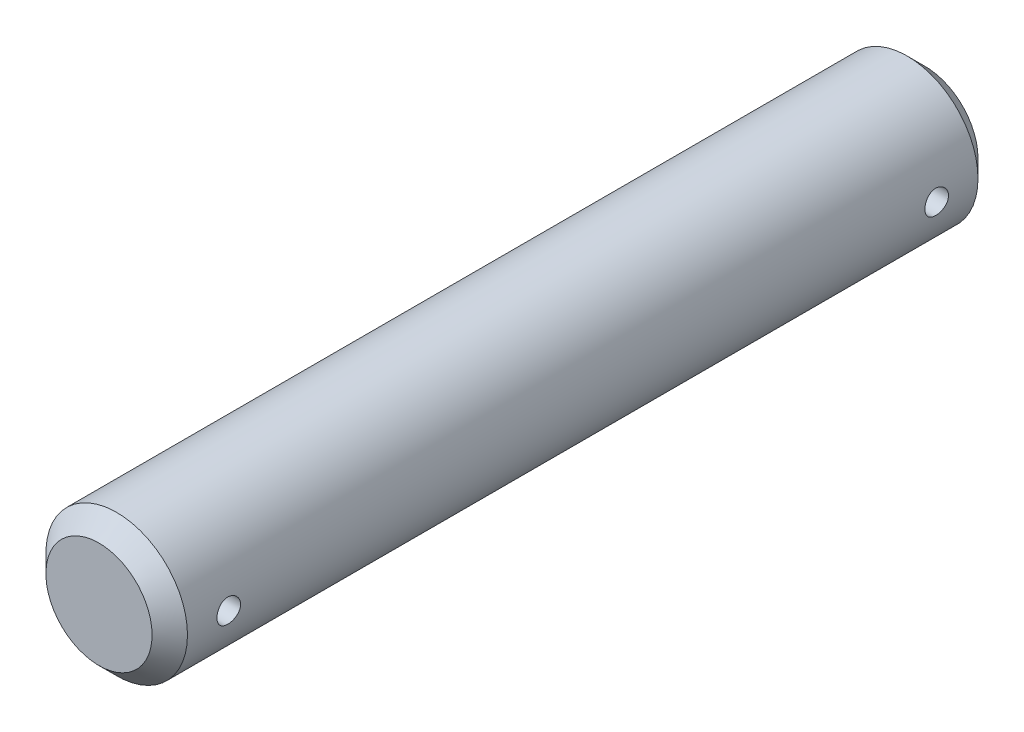
ISO-10303-21;
HEADER;
FILE_DESCRIPTION(('STEP AP214'),'2;1');
FILE_NAME('part.step','',(''),(''),'','','');
FILE_SCHEMA(('AUTOMOTIVE_DESIGN { 1 0 10303 214 1 1 1 1 }'));
ENDSEC;
DATA;
#1=APPLICATION_CONTEXT('core data for automotive mechanical design processes');
#2=APPLICATION_PROTOCOL_DEFINITION('international standard','automotive_design',2000,#1);
#3=PRODUCT_CONTEXT('',#1,'mechanical');
#4=PRODUCT('Part','Part','',(#3));
#5=PRODUCT_RELATED_PRODUCT_CATEGORY('part','',(#4));
#6=PRODUCT_DEFINITION_FORMATION('','',#4);
#7=PRODUCT_DEFINITION_CONTEXT('part definition',#1,'design');
#8=PRODUCT_DEFINITION('design','',#6,#7);
#9=PRODUCT_DEFINITION_SHAPE('','',#8);
#10=(LENGTH_UNIT() NAMED_UNIT(*) SI_UNIT(.MILLI.,.METRE.));
#11=(NAMED_UNIT(*) PLANE_ANGLE_UNIT() SI_UNIT($,.RADIAN.));
#12=(NAMED_UNIT(*) SI_UNIT($,.STERADIAN.) SOLID_ANGLE_UNIT());
#13=UNCERTAINTY_MEASURE_WITH_UNIT(LENGTH_MEASURE(1.E-05),#10,'distance_accuracy_value','');
#14=(GEOMETRIC_REPRESENTATION_CONTEXT(3) GLOBAL_UNCERTAINTY_ASSIGNED_CONTEXT((#13)) GLOBAL_UNIT_ASSIGNED_CONTEXT((#10,
#11,#12)) REPRESENTATION_CONTEXT('',''));
#15=CARTESIAN_POINT('',(0.,0.,0.));
#16=DIRECTION('',(0.,0.,1.));
#17=DIRECTION('',(1.,0.,0.));
#18=AXIS2_PLACEMENT_3D('',#15,#16,#17);
#19=CARTESIAN_POINT('',(0.,0.,-35.));
#20=DIRECTION('',(0.,0.,1.));
#21=DIRECTION('',(1.,0.,0.));
#22=AXIS2_PLACEMENT_3D('',#19,#20,#21);
#23=PLANE('',#22);
#24=CARTESIAN_POINT('',(0.,0.,-35.));
#25=DIRECTION('',(0.,0.,1.));
#26=DIRECTION('',(1.,0.,0.));
#27=AXIS2_PLACEMENT_3D('',#24,#25,#26);
#28=CIRCLE('',#27,4.5);
#29=CARTESIAN_POINT('',(4.5,0.,-35.));
#30=VERTEX_POINT('',#29);
#31=EDGE_CURVE('E83',#30,#30,#28,.T.);
#32=ORIENTED_EDGE('',*,*,#31,.F.);
#33=EDGE_LOOP('',(#32));
#34=FACE_BOUND('',#33,.T.);
#35=ADVANCED_FACE('F34',(#34),#23,.F.);
#36=CARTESIAN_POINT('',(0.,0.,-35.));
#37=DIRECTION('',(0.,0.,1.));
#38=DIRECTION('',(1.,0.,0.));
#39=AXIS2_PLACEMENT_3D('',#36,#37,#38);
#40=CONICAL_SURFACE('',#39,4.5,0.785398163397448);
#41=CARTESIAN_POINT('',(0.,0.,-33.5));
#42=DIRECTION('',(0.,0.,1.));
#43=DIRECTION('',(1.,0.,0.));
#44=AXIS2_PLACEMENT_3D('',#41,#42,#43);
#45=CIRCLE('',#44,6.);
#46=CARTESIAN_POINT('',(6.,0.,-33.5));
#47=VERTEX_POINT('',#46);
#48=EDGE_CURVE('E86',#47,#47,#45,.T.);
#49=ORIENTED_EDGE('',*,*,#48,.F.);
#50=EDGE_LOOP('',(#49));
#51=FACE_BOUND('',#50,.T.);
#52=ORIENTED_EDGE('',*,*,#31,.T.);
#53=EDGE_LOOP('',(#52));
#54=FACE_BOUND('',#53,.T.);
#55=ADVANCED_FACE('F104',(#51,#54),#40,.T.);
#56=CARTESIAN_POINT('',(0.,0.,35.));
#57=DIRECTION('',(0.,0.,1.));
#58=DIRECTION('',(1.,0.,0.));
#59=AXIS2_PLACEMENT_3D('',#56,#57,#58);
#60=CYLINDRICAL_SURFACE('',#59,6.);
#61=CARTESIAN_POINT('',(-6.,0.,-31.));
#62=CARTESIAN_POINT('',(-5.99999904467529,0.055756361983286,-30.9999977644209));
#63=CARTESIAN_POINT('',(-5.99921471165214,0.111543152735529,-30.9953210900124));
#64=CARTESIAN_POINT('',(-5.99616137976555,0.221552088669217,-30.9767457364939));
#65=CARTESIAN_POINT('',(-5.99389101569556,0.275772747183699,-30.9628385772354));
#66=CARTESIAN_POINT('',(-5.9881202729458,0.381041898885058,-30.9262338205629));
#67=CARTESIAN_POINT('',(-5.98462090063677,0.432092947372761,-30.9035434137438));
#68=CARTESIAN_POINT('',(-5.97677690832828,0.529656736791178,-30.850035083179));
#69=CARTESIAN_POINT('',(-5.97243238501774,0.576169995951437,-30.8192180890068));
#70=CARTESIAN_POINT('',(-5.96333326983325,0.663789045716673,-30.7500179664718));
#71=CARTESIAN_POINT('',(-5.95857548725943,0.704845161413988,-30.7115723541456));
#72=CARTESIAN_POINT('',(-5.94921050750693,0.779955399463972,-30.6283408126109));
#73=CARTESIAN_POINT('',(-5.94460331985067,0.814009079756389,-30.5835544834174));
#74=CARTESIAN_POINT('',(-5.93603026303912,0.874346850242053,-30.4885716135212));
#75=CARTESIAN_POINT('',(-5.93206851636654,0.900581821144401,-30.4383434652781));
#76=CARTESIAN_POINT('',(-5.9252791591787,0.944223346164488,-30.3341161742798));
#77=CARTESIAN_POINT('',(-5.92245147205723,0.961630496626246,-30.280117286529));
#78=CARTESIAN_POINT('',(-5.91828214737102,0.986965751113925,-30.1704078900574));
#79=CARTESIAN_POINT('',(-5.9169270739428,0.994979611654162,-30.1147177053994));
#80=CARTESIAN_POINT('',(-5.9158157557466,1.00156669011595,-30.0027678892466));
#81=CARTESIAN_POINT('',(-5.91605939782886,1.0001405761556,-29.9465082983331));
#82=CARTESIAN_POINT('',(-5.91810571545422,0.987958039358462,-29.8356288554898));
#83=CARTESIAN_POINT('',(-5.91989229327567,0.97729795275591,-29.7809980785819));
#84=CARTESIAN_POINT('',(-5.92479798084403,0.947101256161379,-29.6743114728684));
#85=CARTESIAN_POINT('',(-5.92791713629309,0.927564341727898,-29.6222557324446));
#86=CARTESIAN_POINT('',(-5.9351539173364,0.880070898437567,-29.5219084706236));
#87=CARTESIAN_POINT('',(-5.9392762684293,0.852074365551888,-29.4736362375675));
#88=CARTESIAN_POINT('',(-5.94805167366003,0.788484807022975,-29.3824382397846));
#89=CARTESIAN_POINT('',(-5.95270477061714,0.752891168261716,-29.339512907018));
#90=CARTESIAN_POINT('',(-5.96208811151914,0.674592884863623,-29.2596695656771));
#91=CARTESIAN_POINT('',(-5.96681859692661,0.631805585549252,-29.222832592584));
#92=CARTESIAN_POINT('',(-5.97577040558689,0.54061409959266,-29.1568488949339));
#93=CARTESIAN_POINT('',(-5.97999172555898,0.49220987676257,-29.1277022199267));
#94=CARTESIAN_POINT('',(-5.98745557157165,0.391082366466685,-29.0779191091455));
#95=CARTESIAN_POINT('',(-5.99069727362979,0.338355490225865,-29.0572898322675));
#96=CARTESIAN_POINT('',(-5.99583001205064,0.230119338241094,-29.0252023139016));
#97=CARTESIAN_POINT('',(-5.9977211614019,0.174610295671789,-29.0137433052105));
#98=CARTESIAN_POINT('',(-5.99992451937074,0.063083960520651,-29.0004314566156));
#99=CARTESIAN_POINT('',(-6.00025501205114,0.00708029486040592,-28.9984673712778));
#100=CARTESIAN_POINT('',(-5.99934989768468,-0.104455909155954,-29.0039045377712));
#101=CARTESIAN_POINT('',(-5.99811435089647,-0.159988465556815,-29.0113054292535));
#102=CARTESIAN_POINT('',(-5.99422730775281,-0.268662470218705,-29.0351699397342));
#103=CARTESIAN_POINT('',(-5.99158441920524,-0.321816347354151,-29.051578483356));
#104=CARTESIAN_POINT('',(-5.98517785782143,-0.424618753944177,-29.0929338072798));
#105=CARTESIAN_POINT('',(-5.98141412204808,-0.474267086363888,-29.1178810670541));
#106=CARTESIAN_POINT('',(-5.97313806520963,-0.569132275787585,-29.1758604498787));
#107=CARTESIAN_POINT('',(-5.96861942354809,-0.61430610037486,-29.2089620624669));
#108=CARTESIAN_POINT('',(-5.9593538695676,-0.698497434201076,-29.282214926154));
#109=CARTESIAN_POINT('',(-5.95460694068619,-0.737514495878634,-29.3223666893107));
#110=CARTESIAN_POINT('',(-5.94536070094338,-0.808697111863202,-29.4090790192286));
#111=CARTESIAN_POINT('',(-5.94086446454842,-0.840787504445488,-29.4557016662058));
#112=CARTESIAN_POINT('',(-5.93268611911154,-0.896680924117996,-29.5537411876554));
#113=CARTESIAN_POINT('',(-5.92900398426408,-0.92048421390793,-29.605157910091));
#114=CARTESIAN_POINT('',(-5.92289381479082,-0.95901533258926,-29.7111158931249));
#115=CARTESIAN_POINT('',(-5.92046061724426,-0.973780573019179,-29.7656432380122));
#116=CARTESIAN_POINT('',(-5.91711086734104,-0.993934181511312,-29.8764480516887));
#117=CARTESIAN_POINT('',(-5.91619418313089,-0.999323364778469,-29.9327253678928));
#118=CARTESIAN_POINT('',(-5.91598693233605,-1.00054914641894,-30.044682066385));
#119=CARTESIAN_POINT('',(-5.9166762260226,-0.996504054450076,-30.1003601514301));
#120=CARTESIAN_POINT('',(-5.91955912581491,-0.979231935582741,-30.2102316992203));
#121=CARTESIAN_POINT('',(-5.92175272704486,-0.966004938444992,-30.2644251667767));
#122=CARTESIAN_POINT('',(-5.92738942512687,-0.930789795837963,-30.369743374917));
#123=CARTESIAN_POINT('',(-5.93083106887868,-0.908811836240179,-30.4208716040224));
#124=CARTESIAN_POINT('',(-5.93857747568883,-0.856730801566366,-30.5187342676779));
#125=CARTESIAN_POINT('',(-5.9428822815536,-0.826627323499428,-30.5654684841489));
#126=CARTESIAN_POINT('',(-5.95193381618249,-0.758727553748865,-30.6538142332431));
#127=CARTESIAN_POINT('',(-5.95668518230521,-0.720844225437461,-30.6953584066801));
#128=CARTESIAN_POINT('',(-5.96605748944336,-0.638643612552094,-30.77154064179));
#129=CARTESIAN_POINT('',(-5.97067840010619,-0.594324845165057,-30.8061771074553));
#130=CARTESIAN_POINT('',(-5.97930611856888,-0.500147667856114,-30.86777930728));
#131=CARTESIAN_POINT('',(-5.98330846501242,-0.450253115013128,-30.8946904157252));
#132=CARTESIAN_POINT('',(-5.9902046704071,-0.346605227751593,-30.939707793844));
#133=CARTESIAN_POINT('',(-5.99309963270993,-0.292855797932005,-30.9578228324319));
#134=CARTESIAN_POINT('',(-5.99682316333182,-0.199081324018162,-30.9808021096507));
#135=CARTESIAN_POINT('',(-5.99800810909344,-0.15962353211938,-30.9879897878464));
#136=CARTESIAN_POINT('',(-5.99959686394448,-0.0801157241279242,-30.9975894951379));
#137=CARTESIAN_POINT('',(-6.00000068648257,-0.040065718243398,-31.0000016064549));
#138=CARTESIAN_POINT('',(-6.,0.,-31.));
#139=B_SPLINE_CURVE_WITH_KNOTS('',3,(#61,#62,#63,#64,#65,#66,#67,#68,#69,#70,#71,#72,#73,#74,
#75,#76,#77,#78,#79,#80,#81,#82,#83,#84,#85,#86,#87,#88,#89,#90,#91,#92,#93,#94,#95,#96,#97,#98,
#99,#100,#101,#102,#103,#104,#105,#106,#107,#108,#109,#110,#111,#112,#113,#114,#115,#116,#117,
#118,#119,#120,#121,#122,#123,#124,#125,#126,#127,#128,#129,#130,#131,#132,#133,#134,#135,#136,
#137,#138),.UNSPECIFIED.,.T.,.F.,(4,2,2,2,2,2,2,2,2,2,2,2,2,2,2,2,2,2,2,2,2,2,2,2,2,2,2,2,2,2,2,
2,2,2,2,2,2,2,4),(0.,0.167122633975404,0.334399018278169,0.50153874681011,0.668659365069918,
0.837209964249329,1.00577120067943,1.17537008329536,1.34495750750472,1.5129843084137,
1.68099921728355,1.84728208704164,2.01357066010153,2.18065822653023,2.3477592827223,
2.51693107964531,2.68610396654339,2.85541875566362,3.0247193780846,3.19203153396559,
3.35933725214344,3.52563122802567,3.69193454330427,3.8597073025081,4.02749225221714,
4.19701528803049,4.36653294950378,4.53534408936709,4.70414055114647,4.8708316380908,
5.03752218475254,5.2040192729049,5.37052462011735,5.53900553677357,5.7075253355159,
5.87720892642881,6.04672300852029,6.16681699265608,6.28690890910788),.UNSPECIFIED.);
#140=CARTESIAN_POINT('',(-6.,0.,-31.));
#141=VERTEX_POINT('',#140);
#142=EDGE_CURVE('E10',#141,#141,#139,.T.);
#143=ORIENTED_EDGE('',*,*,#142,.T.);
#144=EDGE_LOOP('',(#143));
#145=FACE_BOUND('',#144,.T.);
#146=CARTESIAN_POINT('',(6.,0.,-31.));
#147=CARTESIAN_POINT('',(5.99999904467529,-0.055756361983286,-30.9999977644209));
#148=CARTESIAN_POINT('',(5.99921471165214,-0.111543152735529,-30.9953210900124));
#149=CARTESIAN_POINT('',(5.99616137976555,-0.221552088669217,-30.9767457364939));
#150=CARTESIAN_POINT('',(5.99389101569556,-0.275772747183699,-30.9628385772354));
#151=CARTESIAN_POINT('',(5.9881202729458,-0.381041898885058,-30.9262338205629));
#152=CARTESIAN_POINT('',(5.98462090063677,-0.432092947372761,-30.9035434137438));
#153=CARTESIAN_POINT('',(5.97677690832828,-0.529656736791178,-30.850035083179));
#154=CARTESIAN_POINT('',(5.97243238501774,-0.576169995951437,-30.8192180890068));
#155=CARTESIAN_POINT('',(5.96333326983325,-0.663789045716673,-30.7500179664718));
#156=CARTESIAN_POINT('',(5.95857548725943,-0.704845161413988,-30.7115723541456));
#157=CARTESIAN_POINT('',(5.94921050750693,-0.779955399463972,-30.6283408126109));
#158=CARTESIAN_POINT('',(5.94460331985067,-0.814009079756389,-30.5835544834174));
#159=CARTESIAN_POINT('',(5.93603026303912,-0.874346850242053,-30.4885716135212));
#160=CARTESIAN_POINT('',(5.93206851636654,-0.900581821144401,-30.4383434652781));
#161=CARTESIAN_POINT('',(5.9252791591787,-0.944223346164488,-30.3341161742798));
#162=CARTESIAN_POINT('',(5.92245147205723,-0.961630496626246,-30.280117286529));
#163=CARTESIAN_POINT('',(5.91828214737102,-0.986965751113925,-30.1704078900574));
#164=CARTESIAN_POINT('',(5.9169270739428,-0.994979611654162,-30.1147177053994));
#165=CARTESIAN_POINT('',(5.9158157557466,-1.00156669011595,-30.0027678892466));
#166=CARTESIAN_POINT('',(5.91605939782886,-1.0001405761556,-29.9465082983331));
#167=CARTESIAN_POINT('',(5.91810571545422,-0.987958039358462,-29.8356288554898));
#168=CARTESIAN_POINT('',(5.91989229327567,-0.97729795275591,-29.7809980785819));
#169=CARTESIAN_POINT('',(5.92479798084403,-0.947101256161379,-29.6743114728684));
#170=CARTESIAN_POINT('',(5.92791713629309,-0.927564341727898,-29.6222557324446));
#171=CARTESIAN_POINT('',(5.9351539173364,-0.880070898437567,-29.5219084706236));
#172=CARTESIAN_POINT('',(5.9392762684293,-0.852074365551888,-29.4736362375675));
#173=CARTESIAN_POINT('',(5.94805167366003,-0.788484807022975,-29.3824382397846));
#174=CARTESIAN_POINT('',(5.95270477061714,-0.752891168261716,-29.339512907018));
#175=CARTESIAN_POINT('',(5.96208811151914,-0.674592884863623,-29.2596695656771));
#176=CARTESIAN_POINT('',(5.96681859692661,-0.631805585549252,-29.222832592584));
#177=CARTESIAN_POINT('',(5.97577040558689,-0.54061409959266,-29.1568488949339));
#178=CARTESIAN_POINT('',(5.97999172555898,-0.49220987676257,-29.1277022199267));
#179=CARTESIAN_POINT('',(5.98745557157165,-0.391082366466685,-29.0779191091455));
#180=CARTESIAN_POINT('',(5.99069727362979,-0.338355490225865,-29.0572898322675));
#181=CARTESIAN_POINT('',(5.99583001205064,-0.230119338241094,-29.0252023139016));
#182=CARTESIAN_POINT('',(5.9977211614019,-0.174610295671789,-29.0137433052105));
#183=CARTESIAN_POINT('',(5.99992451937074,-0.063083960520651,-29.0004314566156));
#184=CARTESIAN_POINT('',(6.00025501205114,-0.00708029486040592,-28.9984673712778));
#185=CARTESIAN_POINT('',(5.99934989768468,0.104455909155954,-29.0039045377712));
#186=CARTESIAN_POINT('',(5.99811435089647,0.159988465556815,-29.0113054292535));
#187=CARTESIAN_POINT('',(5.99422730775281,0.268662470218705,-29.0351699397342));
#188=CARTESIAN_POINT('',(5.99158441920524,0.321816347354151,-29.051578483356));
#189=CARTESIAN_POINT('',(5.98517785782143,0.424618753944177,-29.0929338072798));
#190=CARTESIAN_POINT('',(5.98141412204808,0.474267086363888,-29.1178810670541));
#191=CARTESIAN_POINT('',(5.97313806520963,0.569132275787585,-29.1758604498787));
#192=CARTESIAN_POINT('',(5.96861942354809,0.61430610037486,-29.2089620624669));
#193=CARTESIAN_POINT('',(5.9593538695676,0.698497434201076,-29.282214926154));
#194=CARTESIAN_POINT('',(5.95460694068619,0.737514495878634,-29.3223666893107));
#195=CARTESIAN_POINT('',(5.94536070094338,0.808697111863202,-29.4090790192286));
#196=CARTESIAN_POINT('',(5.94086446454842,0.840787504445488,-29.4557016662058));
#197=CARTESIAN_POINT('',(5.93268611911154,0.896680924117996,-29.5537411876554));
#198=CARTESIAN_POINT('',(5.92900398426408,0.92048421390793,-29.605157910091));
#199=CARTESIAN_POINT('',(5.92289381479082,0.95901533258926,-29.7111158931249));
#200=CARTESIAN_POINT('',(5.92046061724426,0.973780573019179,-29.7656432380122));
#201=CARTESIAN_POINT('',(5.91711086734104,0.993934181511312,-29.8764480516887));
#202=CARTESIAN_POINT('',(5.91619418313089,0.999323364778469,-29.9327253678928));
#203=CARTESIAN_POINT('',(5.91598693233605,1.00054914641894,-30.044682066385));
#204=CARTESIAN_POINT('',(5.9166762260226,0.996504054450076,-30.1003601514301));
#205=CARTESIAN_POINT('',(5.91955912581491,0.979231935582741,-30.2102316992203));
#206=CARTESIAN_POINT('',(5.92175272704486,0.966004938444992,-30.2644251667767));
#207=CARTESIAN_POINT('',(5.92738942512687,0.930789795837963,-30.369743374917));
#208=CARTESIAN_POINT('',(5.93083106887868,0.908811836240179,-30.4208716040224));
#209=CARTESIAN_POINT('',(5.93857747568883,0.856730801566366,-30.5187342676779));
#210=CARTESIAN_POINT('',(5.9428822815536,0.826627323499428,-30.5654684841489));
#211=CARTESIAN_POINT('',(5.95193381618249,0.758727553748865,-30.6538142332431));
#212=CARTESIAN_POINT('',(5.95668518230521,0.720844225437461,-30.6953584066801));
#213=CARTESIAN_POINT('',(5.96605748944336,0.638643612552094,-30.77154064179));
#214=CARTESIAN_POINT('',(5.97067840010619,0.594324845165057,-30.8061771074553));
#215=CARTESIAN_POINT('',(5.97930611856888,0.500147667856114,-30.86777930728));
#216=CARTESIAN_POINT('',(5.98330846501242,0.450253115013128,-30.8946904157252));
#217=CARTESIAN_POINT('',(5.9902046704071,0.346605227751593,-30.939707793844));
#218=CARTESIAN_POINT('',(5.99309963270993,0.292855797932005,-30.9578228324319));
#219=CARTESIAN_POINT('',(5.99682316333182,0.199081324018162,-30.9808021096507));
#220=CARTESIAN_POINT('',(5.99800810909344,0.15962353211938,-30.9879897878464));
#221=CARTESIAN_POINT('',(5.99959686394448,0.0801157241279242,-30.9975894951379));
#222=CARTESIAN_POINT('',(6.00000068648257,0.040065718243398,-31.0000016064549));
#223=CARTESIAN_POINT('',(6.,0.,-31.));
#224=B_SPLINE_CURVE_WITH_KNOTS('',3,(#146,#147,#148,#149,#150,#151,#152,#153,#154,#155,#156,
#157,#158,#159,#160,#161,#162,#163,#164,#165,#166,#167,#168,#169,#170,#171,#172,#173,#174,#175,
#176,#177,#178,#179,#180,#181,#182,#183,#184,#185,#186,#187,#188,#189,#190,#191,#192,#193,#194,
#195,#196,#197,#198,#199,#200,#201,#202,#203,#204,#205,#206,#207,#208,#209,#210,#211,#212,#213,
#214,#215,#216,#217,#218,#219,#220,#221,#222,#223),.UNSPECIFIED.,.T.,.F.,(4,2,2,2,2,2,2,2,2,2,2,
2,2,2,2,2,2,2,2,2,2,2,2,2,2,2,2,2,2,2,2,2,2,2,2,2,2,2,4),(0.,0.167122633975404,
0.334399018278169,0.50153874681011,0.668659365069918,0.837209964249329,1.00577120067943,
1.17537008329536,1.34495750750472,1.5129843084137,1.68099921728355,1.84728208704164,
2.01357066010153,2.18065822653023,2.3477592827223,2.51693107964531,2.68610396654339,
2.85541875566362,3.0247193780846,3.19203153396559,3.35933725214344,3.52563122802567,
3.69193454330427,3.8597073025081,4.02749225221714,4.19701528803049,4.36653294950378,
4.53534408936709,4.70414055114647,4.8708316380908,5.03752218475254,5.2040192729049,
5.37052462011735,5.53900553677357,5.7075253355159,5.87720892642881,6.04672300852029,
6.16681699265608,6.28690890910788),.UNSPECIFIED.);
#225=CARTESIAN_POINT('',(6.,0.,-31.));
#226=VERTEX_POINT('',#225);
#227=EDGE_CURVE('E45',#226,#226,#224,.T.);
#228=ORIENTED_EDGE('',*,*,#227,.T.);
#229=EDGE_LOOP('',(#228));
#230=FACE_BOUND('',#229,.T.);
#231=CARTESIAN_POINT('',(-6.,0.,29.));
#232=CARTESIAN_POINT('',(-5.99999904467529,0.055756361983286,29.0000022355791));
#233=CARTESIAN_POINT('',(-5.99921471165214,0.111543152735529,29.0046789099876));
#234=CARTESIAN_POINT('',(-5.99616137976555,0.221552088669217,29.0232542635061));
#235=CARTESIAN_POINT('',(-5.99389101569556,0.275772747183699,29.0371614227646));
#236=CARTESIAN_POINT('',(-5.9881202729458,0.381041898885058,29.0737661794371));
#237=CARTESIAN_POINT('',(-5.98462090063677,0.432092947372761,29.0964565862562));
#238=CARTESIAN_POINT('',(-5.97677690832828,0.529656736791178,29.149964916821));
#239=CARTESIAN_POINT('',(-5.97243238501774,0.576169995951437,29.1807819109932));
#240=CARTESIAN_POINT('',(-5.96333326983325,0.663789045716673,29.2499820335282));
#241=CARTESIAN_POINT('',(-5.95857548725943,0.704845161413988,29.2884276458545));
#242=CARTESIAN_POINT('',(-5.94921050750693,0.779955399463972,29.3716591873891));
#243=CARTESIAN_POINT('',(-5.94460331985067,0.814009079756389,29.4164455165826));
#244=CARTESIAN_POINT('',(-5.93603026303912,0.874346850242054,29.5114283864788));
#245=CARTESIAN_POINT('',(-5.93206851636654,0.900581821144402,29.5616565347219));
#246=CARTESIAN_POINT('',(-5.9252791591787,0.944223346164489,29.6658838257203));
#247=CARTESIAN_POINT('',(-5.92245147205723,0.961630496626247,29.7198827134711));
#248=CARTESIAN_POINT('',(-5.91828214737102,0.986965751113925,29.8295921099426));
#249=CARTESIAN_POINT('',(-5.9169270739428,0.994979611654162,29.8852822946006));
#250=CARTESIAN_POINT('',(-5.9158157557466,1.00156669011595,29.9972321107534));
#251=CARTESIAN_POINT('',(-5.91605939782886,1.0001405761556,30.0534917016669));
#252=CARTESIAN_POINT('',(-5.91810571545422,0.987958039358462,30.1643711445102));
#253=CARTESIAN_POINT('',(-5.91989229327567,0.97729795275591,30.2190019214181));
#254=CARTESIAN_POINT('',(-5.92479798084403,0.947101256161379,30.3256885271317));
#255=CARTESIAN_POINT('',(-5.92791713629309,0.927564341727898,30.3777442675554));
#256=CARTESIAN_POINT('',(-5.9351539173364,0.880070898437567,30.4780915293764));
#257=CARTESIAN_POINT('',(-5.9392762684293,0.852074365551888,30.5263637624325));
#258=CARTESIAN_POINT('',(-5.94805167366003,0.788484807022975,30.6175617602154));
#259=CARTESIAN_POINT('',(-5.95270477061714,0.752891168261716,30.660487092982));
#260=CARTESIAN_POINT('',(-5.96208811151914,0.674592884863623,30.7403304343229));
#261=CARTESIAN_POINT('',(-5.96681859692661,0.631805585549252,30.777167407416));
#262=CARTESIAN_POINT('',(-5.97577040558689,0.54061409959266,30.8431511050661));
#263=CARTESIAN_POINT('',(-5.97999172555898,0.49220987676257,30.8722977800733));
#264=CARTESIAN_POINT('',(-5.98745557157165,0.391082366466685,30.9220808908545));
#265=CARTESIAN_POINT('',(-5.99069727362979,0.338355490225865,30.9427101677325));
#266=CARTESIAN_POINT('',(-5.99583001205064,0.230119338241094,30.9747976860984));
#267=CARTESIAN_POINT('',(-5.9977211614019,0.174610295671789,30.9862566947895));
#268=CARTESIAN_POINT('',(-5.99992451937074,0.063083960520651,30.9995685433845));
#269=CARTESIAN_POINT('',(-6.00025501205114,0.00708029486040592,31.0015326287222));
#270=CARTESIAN_POINT('',(-5.99934989768468,-0.104455909155954,30.9960954622288));
#271=CARTESIAN_POINT('',(-5.99811435089647,-0.159988465556815,30.9886945707465));
#272=CARTESIAN_POINT('',(-5.99422730775281,-0.268662470218705,30.9648300602658));
#273=CARTESIAN_POINT('',(-5.99158441920524,-0.321816347354151,30.948421516644));
#274=CARTESIAN_POINT('',(-5.98517785782143,-0.424618753944177,30.9070661927202));
#275=CARTESIAN_POINT('',(-5.98141412204808,-0.474267086363888,30.8821189329459));
#276=CARTESIAN_POINT('',(-5.97313806520963,-0.569132275787585,30.8241395501213));
#277=CARTESIAN_POINT('',(-5.96861942354809,-0.61430610037486,30.7910379375331));
#278=CARTESIAN_POINT('',(-5.9593538695676,-0.698497434201076,30.717785073846));
#279=CARTESIAN_POINT('',(-5.95460694068619,-0.737514495878634,30.6776333106893));
#280=CARTESIAN_POINT('',(-5.94536070094338,-0.808697111863201,30.5909209807714));
#281=CARTESIAN_POINT('',(-5.94086446454842,-0.840787504445486,30.5442983337942));
#282=CARTESIAN_POINT('',(-5.93268611911154,-0.896680924117995,30.4462588123446));
#283=CARTESIAN_POINT('',(-5.92900398426408,-0.920484213907929,30.394842089909));
#284=CARTESIAN_POINT('',(-5.92289381479082,-0.95901533258926,30.2888841068752));
#285=CARTESIAN_POINT('',(-5.92046061724426,-0.973780573019179,30.2343567619878));
#286=CARTESIAN_POINT('',(-5.91711086734104,-0.993934181511312,30.1235519483113));
#287=CARTESIAN_POINT('',(-5.91619418313089,-0.999323364778469,30.0672746321072));
#288=CARTESIAN_POINT('',(-5.91598693233605,-1.00054914641894,29.955317933615));
#289=CARTESIAN_POINT('',(-5.9166762260226,-0.996504054450076,29.8996398485699));
#290=CARTESIAN_POINT('',(-5.91955912581491,-0.979231935582741,29.7897683007797));
#291=CARTESIAN_POINT('',(-5.92175272704486,-0.966004938444992,29.7355748332233));
#292=CARTESIAN_POINT('',(-5.92738942512688,-0.930789795837962,29.630256625083));
#293=CARTESIAN_POINT('',(-5.93083106887868,-0.908811836240178,29.5791283959776));
#294=CARTESIAN_POINT('',(-5.93857747568883,-0.856730801566365,29.4812657323221));
#295=CARTESIAN_POINT('',(-5.9428822815536,-0.826627323499427,29.4345315158511));
#296=CARTESIAN_POINT('',(-5.95193381618249,-0.758727553748865,29.3461857667569));
#297=CARTESIAN_POINT('',(-5.95668518230521,-0.720844225437462,29.3046415933199));
#298=CARTESIAN_POINT('',(-5.96605748944336,-0.638643612552095,29.22845935821));
#299=CARTESIAN_POINT('',(-5.97067840010619,-0.594324845165057,29.1938228925447));
#300=CARTESIAN_POINT('',(-5.97930611856888,-0.500147667856115,29.13222069272));
#301=CARTESIAN_POINT('',(-5.98330846501242,-0.450253115013129,29.1053095842748));
#302=CARTESIAN_POINT('',(-5.9902046704071,-0.346605227751595,29.060292206156));
#303=CARTESIAN_POINT('',(-5.99309963270993,-0.292855797932006,29.0421771675681));
#304=CARTESIAN_POINT('',(-5.99682316333182,-0.199081324018162,29.0191978903493));
#305=CARTESIAN_POINT('',(-5.99800810909344,-0.15962353211938,29.0120102121536));
#306=CARTESIAN_POINT('',(-5.99959686394448,-0.0801157241279242,29.0024105048621));
#307=CARTESIAN_POINT('',(-6.00000068648257,-0.040065718243398,28.9999983935451));
#308=CARTESIAN_POINT('',(-6.,0.,29.));
#309=B_SPLINE_CURVE_WITH_KNOTS('',3,(#231,#232,#233,#234,#235,#236,#237,#238,#239,#240,#241,
#242,#243,#244,#245,#246,#247,#248,#249,#250,#251,#252,#253,#254,#255,#256,#257,#258,#259,#260,
#261,#262,#263,#264,#265,#266,#267,#268,#269,#270,#271,#272,#273,#274,#275,#276,#277,#278,#279,
#280,#281,#282,#283,#284,#285,#286,#287,#288,#289,#290,#291,#292,#293,#294,#295,#296,#297,#298,
#299,#300,#301,#302,#303,#304,#305,#306,#307,#308),.UNSPECIFIED.,.T.,.F.,(4,2,2,2,2,2,2,2,2,2,2,
2,2,2,2,2,2,2,2,2,2,2,2,2,2,2,2,2,2,2,2,2,2,2,2,2,2,2,4),(0.,0.167122633975404,
0.334399018278169,0.50153874681011,0.668659365069918,0.837209964249329,1.00577120067943,
1.17537008329536,1.34495750750472,1.5129843084137,1.68099921728355,1.84728208704164,
2.01357066010153,2.18065822653023,2.3477592827223,2.51693107964531,2.68610396654339,
2.85541875566362,3.0247193780846,3.19203153396559,3.35933725214344,3.52563122802567,
3.69193454330427,3.8597073025081,4.02749225221714,4.19701528803048,4.36653294950378,
4.53534408936709,4.70414055114647,4.8708316380908,5.03752218475254,5.2040192729049,
5.37052462011735,5.53900553677357,5.7075253355159,5.87720892642881,6.04672300852029,
6.16681699265608,6.28690890910788),.UNSPECIFIED.);
#310=CARTESIAN_POINT('',(-6.,0.,29.));
#311=VERTEX_POINT('',#310);
#312=EDGE_CURVE('E49',#311,#311,#309,.T.);
#313=ORIENTED_EDGE('',*,*,#312,.T.);
#314=EDGE_LOOP('',(#313));
#315=FACE_BOUND('',#314,.T.);
#316=CARTESIAN_POINT('',(6.,0.,29.));
#317=CARTESIAN_POINT('',(5.99999904467529,-0.055756361983286,29.0000022355791));
#318=CARTESIAN_POINT('',(5.99921471165214,-0.111543152735529,29.0046789099876));
#319=CARTESIAN_POINT('',(5.99616137976555,-0.221552088669217,29.0232542635061));
#320=CARTESIAN_POINT('',(5.99389101569556,-0.275772747183699,29.0371614227646));
#321=CARTESIAN_POINT('',(5.9881202729458,-0.381041898885058,29.0737661794371));
#322=CARTESIAN_POINT('',(5.98462090063677,-0.432092947372761,29.0964565862562));
#323=CARTESIAN_POINT('',(5.97677690832828,-0.529656736791178,29.149964916821));
#324=CARTESIAN_POINT('',(5.97243238501774,-0.576169995951437,29.1807819109932));
#325=CARTESIAN_POINT('',(5.96333326983325,-0.663789045716673,29.2499820335282));
#326=CARTESIAN_POINT('',(5.95857548725943,-0.704845161413988,29.2884276458545));
#327=CARTESIAN_POINT('',(5.94921050750693,-0.779955399463972,29.3716591873891));
#328=CARTESIAN_POINT('',(5.94460331985067,-0.814009079756389,29.4164455165826));
#329=CARTESIAN_POINT('',(5.93603026303912,-0.874346850242054,29.5114283864788));
#330=CARTESIAN_POINT('',(5.93206851636654,-0.900581821144402,29.5616565347219));
#331=CARTESIAN_POINT('',(5.9252791591787,-0.944223346164489,29.6658838257203));
#332=CARTESIAN_POINT('',(5.92245147205723,-0.961630496626247,29.7198827134711));
#333=CARTESIAN_POINT('',(5.91828214737102,-0.986965751113925,29.8295921099426));
#334=CARTESIAN_POINT('',(5.9169270739428,-0.994979611654162,29.8852822946006));
#335=CARTESIAN_POINT('',(5.9158157557466,-1.00156669011595,29.9972321107534));
#336=CARTESIAN_POINT('',(5.91605939782886,-1.0001405761556,30.0534917016669));
#337=CARTESIAN_POINT('',(5.91810571545422,-0.987958039358462,30.1643711445102));
#338=CARTESIAN_POINT('',(5.91989229327567,-0.97729795275591,30.2190019214181));
#339=CARTESIAN_POINT('',(5.92479798084403,-0.947101256161379,30.3256885271317));
#340=CARTESIAN_POINT('',(5.92791713629309,-0.927564341727898,30.3777442675554));
#341=CARTESIAN_POINT('',(5.9351539173364,-0.880070898437567,30.4780915293764));
#342=CARTESIAN_POINT('',(5.9392762684293,-0.852074365551888,30.5263637624325));
#343=CARTESIAN_POINT('',(5.94805167366003,-0.788484807022975,30.6175617602154));
#344=CARTESIAN_POINT('',(5.95270477061714,-0.752891168261716,30.660487092982));
#345=CARTESIAN_POINT('',(5.96208811151914,-0.674592884863623,30.7403304343229));
#346=CARTESIAN_POINT('',(5.96681859692661,-0.631805585549252,30.777167407416));
#347=CARTESIAN_POINT('',(5.97577040558689,-0.54061409959266,30.8431511050661));
#348=CARTESIAN_POINT('',(5.97999172555898,-0.49220987676257,30.8722977800733));
#349=CARTESIAN_POINT('',(5.98745557157165,-0.391082366466685,30.9220808908545));
#350=CARTESIAN_POINT('',(5.99069727362979,-0.338355490225865,30.9427101677325));
#351=CARTESIAN_POINT('',(5.99583001205064,-0.230119338241094,30.9747976860984));
#352=CARTESIAN_POINT('',(5.9977211614019,-0.174610295671789,30.9862566947895));
#353=CARTESIAN_POINT('',(5.99992451937074,-0.063083960520651,30.9995685433845));
#354=CARTESIAN_POINT('',(6.00025501205114,-0.00708029486040592,31.0015326287222));
#355=CARTESIAN_POINT('',(5.99934989768468,0.104455909155954,30.9960954622288));
#356=CARTESIAN_POINT('',(5.99811435089647,0.159988465556815,30.9886945707465));
#357=CARTESIAN_POINT('',(5.99422730775281,0.268662470218705,30.9648300602658));
#358=CARTESIAN_POINT('',(5.99158441920524,0.321816347354151,30.948421516644));
#359=CARTESIAN_POINT('',(5.98517785782143,0.424618753944177,30.9070661927202));
#360=CARTESIAN_POINT('',(5.98141412204808,0.474267086363888,30.8821189329459));
#361=CARTESIAN_POINT('',(5.97313806520963,0.569132275787585,30.8241395501213));
#362=CARTESIAN_POINT('',(5.96861942354809,0.61430610037486,30.7910379375331));
#363=CARTESIAN_POINT('',(5.9593538695676,0.698497434201076,30.717785073846));
#364=CARTESIAN_POINT('',(5.95460694068619,0.737514495878634,30.6776333106893));
#365=CARTESIAN_POINT('',(5.94536070094338,0.808697111863201,30.5909209807714));
#366=CARTESIAN_POINT('',(5.94086446454842,0.840787504445486,30.5442983337942));
#367=CARTESIAN_POINT('',(5.93268611911154,0.896680924117995,30.4462588123446));
#368=CARTESIAN_POINT('',(5.92900398426408,0.920484213907929,30.394842089909));
#369=CARTESIAN_POINT('',(5.92289381479082,0.95901533258926,30.2888841068752));
#370=CARTESIAN_POINT('',(5.92046061724426,0.973780573019179,30.2343567619878));
#371=CARTESIAN_POINT('',(5.91711086734104,0.993934181511312,30.1235519483113));
#372=CARTESIAN_POINT('',(5.91619418313089,0.999323364778469,30.0672746321072));
#373=CARTESIAN_POINT('',(5.91598693233605,1.00054914641894,29.955317933615));
#374=CARTESIAN_POINT('',(5.9166762260226,0.996504054450076,29.8996398485699));
#375=CARTESIAN_POINT('',(5.91955912581491,0.979231935582741,29.7897683007797));
#376=CARTESIAN_POINT('',(5.92175272704486,0.966004938444992,29.7355748332233));
#377=CARTESIAN_POINT('',(5.92738942512688,0.930789795837962,29.630256625083));
#378=CARTESIAN_POINT('',(5.93083106887868,0.908811836240178,29.5791283959776));
#379=CARTESIAN_POINT('',(5.93857747568883,0.856730801566365,29.4812657323221));
#380=CARTESIAN_POINT('',(5.9428822815536,0.826627323499427,29.4345315158511));
#381=CARTESIAN_POINT('',(5.95193381618249,0.758727553748865,29.3461857667569));
#382=CARTESIAN_POINT('',(5.95668518230521,0.720844225437462,29.3046415933199));
#383=CARTESIAN_POINT('',(5.96605748944336,0.638643612552095,29.22845935821));
#384=CARTESIAN_POINT('',(5.97067840010619,0.594324845165057,29.1938228925447));
#385=CARTESIAN_POINT('',(5.97930611856888,0.500147667856115,29.13222069272));
#386=CARTESIAN_POINT('',(5.98330846501242,0.450253115013129,29.1053095842748));
#387=CARTESIAN_POINT('',(5.9902046704071,0.346605227751595,29.060292206156));
#388=CARTESIAN_POINT('',(5.99309963270993,0.292855797932006,29.0421771675681));
#389=CARTESIAN_POINT('',(5.99682316333182,0.199081324018162,29.0191978903493));
#390=CARTESIAN_POINT('',(5.99800810909344,0.15962353211938,29.0120102121536));
#391=CARTESIAN_POINT('',(5.99959686394448,0.0801157241279242,29.0024105048621));
#392=CARTESIAN_POINT('',(6.00000068648257,0.040065718243398,28.9999983935451));
#393=CARTESIAN_POINT('',(6.,0.,29.));
#394=B_SPLINE_CURVE_WITH_KNOTS('',3,(#316,#317,#318,#319,#320,#321,#322,#323,#324,#325,#326,
#327,#328,#329,#330,#331,#332,#333,#334,#335,#336,#337,#338,#339,#340,#341,#342,#343,#344,#345,
#346,#347,#348,#349,#350,#351,#352,#353,#354,#355,#356,#357,#358,#359,#360,#361,#362,#363,#364,
#365,#366,#367,#368,#369,#370,#371,#372,#373,#374,#375,#376,#377,#378,#379,#380,#381,#382,#383,
#384,#385,#386,#387,#388,#389,#390,#391,#392,#393),.UNSPECIFIED.,.T.,.F.,(4,2,2,2,2,2,2,2,2,2,2,
2,2,2,2,2,2,2,2,2,2,2,2,2,2,2,2,2,2,2,2,2,2,2,2,2,2,2,4),(0.,0.167122633975404,
0.334399018278169,0.50153874681011,0.668659365069918,0.837209964249329,1.00577120067943,
1.17537008329536,1.34495750750472,1.5129843084137,1.68099921728355,1.84728208704164,
2.01357066010153,2.18065822653023,2.3477592827223,2.51693107964531,2.68610396654339,
2.85541875566362,3.0247193780846,3.19203153396559,3.35933725214344,3.52563122802567,
3.69193454330427,3.8597073025081,4.02749225221714,4.19701528803048,4.36653294950378,
4.53534408936709,4.70414055114647,4.8708316380908,5.03752218475254,5.2040192729049,
5.37052462011735,5.53900553677357,5.7075253355159,5.87720892642881,6.04672300852029,
6.16681699265608,6.28690890910788),.UNSPECIFIED.);
#395=CARTESIAN_POINT('',(6.,0.,29.));
#396=VERTEX_POINT('',#395);
#397=EDGE_CURVE('E53',#396,#396,#394,.T.);
#398=ORIENTED_EDGE('',*,*,#397,.T.);
#399=EDGE_LOOP('',(#398));
#400=FACE_BOUND('',#399,.T.);
#401=CARTESIAN_POINT('',(0.,0.,33.5));
#402=DIRECTION('',(0.,0.,1.));
#403=DIRECTION('',(1.,0.,0.));
#404=AXIS2_PLACEMENT_3D('',#401,#402,#403);
#405=CIRCLE('',#404,6.);
#406=CARTESIAN_POINT('',(6.,0.,33.5));
#407=VERTEX_POINT('',#406);
#408=EDGE_CURVE('E89',#407,#407,#405,.T.);
#409=ORIENTED_EDGE('',*,*,#408,.F.);
#410=EDGE_LOOP('',(#409));
#411=FACE_BOUND('',#410,.T.);
#412=ORIENTED_EDGE('',*,*,#48,.T.);
#413=EDGE_LOOP('',(#412));
#414=FACE_BOUND('',#413,.T.);
#415=ADVANCED_FACE('F63',(#145,#230,#315,#400,#411,#414),#60,.T.);
#416=CARTESIAN_POINT('',(0.,0.,33.5));
#417=DIRECTION('',(0.,0.,-1.));
#418=DIRECTION('',(-1.,0.,0.));
#419=AXIS2_PLACEMENT_3D('',#416,#417,#418);
#420=CONICAL_SURFACE('',#419,6.,0.785398163397448);
#421=CARTESIAN_POINT('',(0.,0.,35.));
#422=DIRECTION('',(0.,0.,1.));
#423=DIRECTION('',(1.,0.,0.));
#424=AXIS2_PLACEMENT_3D('',#421,#422,#423);
#425=CIRCLE('',#424,4.5);
#426=CARTESIAN_POINT('',(4.5,0.,35.));
#427=VERTEX_POINT('',#426);
#428=EDGE_CURVE('E92',#427,#427,#425,.T.);
#429=ORIENTED_EDGE('',*,*,#428,.F.);
#430=EDGE_LOOP('',(#429));
#431=FACE_BOUND('',#430,.T.);
#432=ORIENTED_EDGE('',*,*,#408,.T.);
#433=EDGE_LOOP('',(#432));
#434=FACE_BOUND('',#433,.T.);
#435=ADVANCED_FACE('F97',(#431,#434),#420,.T.);
#436=CARTESIAN_POINT('',(0.,4.5,35.));
#437=DIRECTION('',(0.,0.,-1.));
#438=DIRECTION('',(-1.,0.,0.));
#439=AXIS2_PLACEMENT_3D('',#436,#437,#438);
#440=PLANE('',#439);
#441=ORIENTED_EDGE('',*,*,#428,.T.);
#442=EDGE_LOOP('',(#441));
#443=FACE_BOUND('',#442,.T.);
#444=ADVANCED_FACE('F75',(#443),#440,.F.);
#445=CARTESIAN_POINT('',(-6.,0.,30.));
#446=DIRECTION('',(1.,0.,0.));
#447=DIRECTION('',(0.,0.,-1.));
#448=AXIS2_PLACEMENT_3D('',#445,#446,#447);
#449=CYLINDRICAL_SURFACE('',#448,1.);
#450=ORIENTED_EDGE('',*,*,#397,.F.);
#451=EDGE_LOOP('',(#450));
#452=FACE_BOUND('',#451,.T.);
#453=ORIENTED_EDGE('',*,*,#312,.F.);
#454=EDGE_LOOP('',(#453));
#455=FACE_BOUND('',#454,.T.);
#456=ADVANCED_FACE('F69',(#452,#455),#449,.F.);
#457=CARTESIAN_POINT('',(-6.,0.,-30.));
#458=DIRECTION('',(1.,0.,0.));
#459=DIRECTION('',(0.,0.,-1.));
#460=AXIS2_PLACEMENT_3D('',#457,#458,#459);
#461=CYLINDRICAL_SURFACE('',#460,1.);
#462=ORIENTED_EDGE('',*,*,#227,.F.);
#463=EDGE_LOOP('',(#462));
#464=FACE_BOUND('',#463,.T.);
#465=ORIENTED_EDGE('',*,*,#142,.F.);
#466=EDGE_LOOP('',(#465));
#467=FACE_BOUND('',#466,.T.);
#468=ADVANCED_FACE('F66',(#464,#467),#461,.F.);
#469=CLOSED_SHELL('',(#35,#55,#415,#435,#444,#456,#468));
#470=MANIFOLD_SOLID_BREP('B2',#469);
#471=ADVANCED_BREP_SHAPE_REPRESENTATION('',(#18,#470),#14);
#472=SHAPE_DEFINITION_REPRESENTATION(#9,#471);
ENDSEC;
END-ISO-10303-21;
